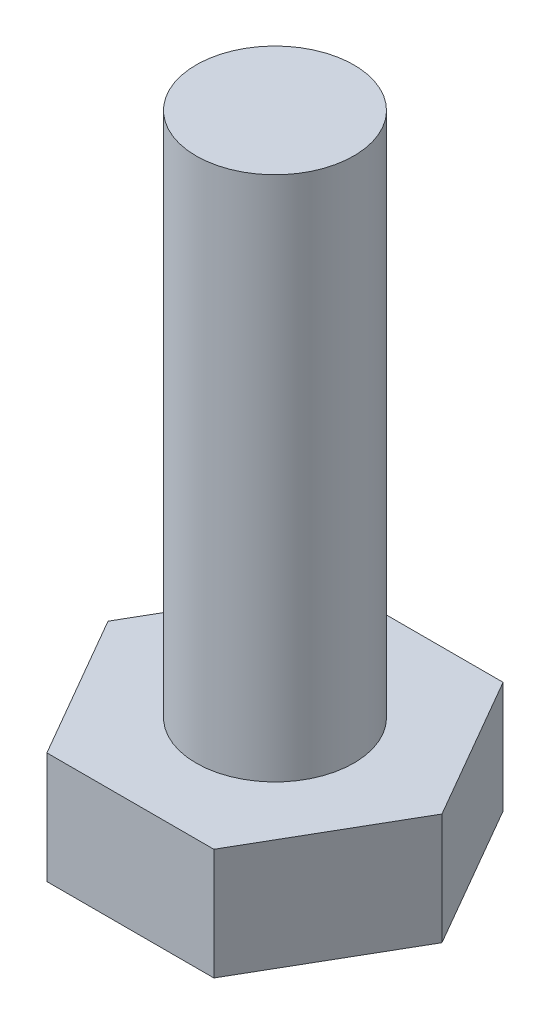
ISO-10303-21;
HEADER;
FILE_DESCRIPTION(('STEP AP214'),'2;1');
FILE_NAME('part.step','',(''),(''),'','','');
FILE_SCHEMA(('AUTOMOTIVE_DESIGN { 1 0 10303 214 1 1 1 1 }'));
ENDSEC;
DATA;
#1=APPLICATION_CONTEXT('core data for automotive mechanical design processes');
#2=APPLICATION_PROTOCOL_DEFINITION('international standard','automotive_design',2000,#1);
#3=PRODUCT_CONTEXT('',#1,'mechanical');
#4=PRODUCT('Part','Part','',(#3));
#5=PRODUCT_RELATED_PRODUCT_CATEGORY('part','',(#4));
#6=PRODUCT_DEFINITION_FORMATION('','',#4);
#7=PRODUCT_DEFINITION_CONTEXT('part definition',#1,'design');
#8=PRODUCT_DEFINITION('design','',#6,#7);
#9=PRODUCT_DEFINITION_SHAPE('','',#8);
#10=(LENGTH_UNIT() NAMED_UNIT(*) SI_UNIT(.MILLI.,.METRE.));
#11=(NAMED_UNIT(*) PLANE_ANGLE_UNIT() SI_UNIT($,.RADIAN.));
#12=(NAMED_UNIT(*) SI_UNIT($,.STERADIAN.) SOLID_ANGLE_UNIT());
#13=UNCERTAINTY_MEASURE_WITH_UNIT(LENGTH_MEASURE(1.E-05),#10,'distance_accuracy_value','');
#14=(GEOMETRIC_REPRESENTATION_CONTEXT(3) GLOBAL_UNCERTAINTY_ASSIGNED_CONTEXT((#13)) GLOBAL_UNIT_ASSIGNED_CONTEXT((#10,
#11,#12)) REPRESENTATION_CONTEXT('',''));
#15=CARTESIAN_POINT('',(0.,0.,0.));
#16=DIRECTION('',(0.,0.,1.));
#17=DIRECTION('',(1.,0.,0.));
#18=AXIS2_PLACEMENT_3D('',#15,#16,#17);
#19=CARTESIAN_POINT('',(0.,10.,0.));
#20=DIRECTION('',(0.,-1.,0.));
#21=DIRECTION('',(0.,0.,-1.));
#22=AXIS2_PLACEMENT_3D('',#19,#20,#21);
#23=CYLINDRICAL_SURFACE('',#22,1.5);
#24=CARTESIAN_POINT('',(0.,10.,0.));
#25=DIRECTION('',(0.,1.,0.));
#26=DIRECTION('',(0.,0.,1.));
#27=AXIS2_PLACEMENT_3D('',#24,#25,#26);
#28=CIRCLE('',#27,1.5);
#29=CARTESIAN_POINT('',(0.,10.,1.5));
#30=VERTEX_POINT('',#29);
#31=EDGE_CURVE('E11',#30,#30,#28,.T.);
#32=ORIENTED_EDGE('',*,*,#31,.F.);
#33=EDGE_LOOP('',(#32));
#34=FACE_BOUND('',#33,.T.);
#35=CARTESIAN_POINT('',(0.,0.,0.));
#36=DIRECTION('',(0.,1.,0.));
#37=DIRECTION('',(0.,0.,1.));
#38=AXIS2_PLACEMENT_3D('',#35,#36,#37);
#39=CIRCLE('',#38,1.5);
#40=CARTESIAN_POINT('',(0.,0.,1.5));
#41=VERTEX_POINT('',#40);
#42=EDGE_CURVE('E37',#41,#41,#39,.T.);
#43=ORIENTED_EDGE('',*,*,#42,.T.);
#44=EDGE_LOOP('',(#43));
#45=FACE_BOUND('',#44,.T.);
#46=ADVANCED_FACE('F34',(#34,#45),#23,.T.);
#47=CARTESIAN_POINT('',(0.,10.,0.));
#48=DIRECTION('',(0.,1.,0.));
#49=DIRECTION('',(0.,0.,1.));
#50=AXIS2_PLACEMENT_3D('',#47,#48,#49);
#51=PLANE('',#50);
#52=ORIENTED_EDGE('',*,*,#31,.T.);
#53=EDGE_LOOP('',(#52));
#54=FACE_BOUND('',#53,.T.);
#55=ADVANCED_FACE('F161',(#54),#51,.T.);
#56=CARTESIAN_POINT('',(-3.17542648054294,-2.12,0.));
#57=DIRECTION('',(0.866025403784439,0.,0.5));
#58=DIRECTION('',(0.5,0.,-0.866025403784439));
#59=AXIS2_PLACEMENT_3D('',#56,#57,#58);
#60=PLANE('',#59);
#61=DIRECTION('',(0.5,0.,-0.866025403784439));
#62=VECTOR('',#61,1.);
#63=CARTESIAN_POINT('',(-3.17542648054294,0.,0.));
#64=LINE('',#63,#62);
#65=CARTESIAN_POINT('',(-3.17542648054294,0.,0.));
#66=VERTEX_POINT('',#65);
#67=CARTESIAN_POINT('',(-1.58771324027147,0.,-2.75));
#68=VERTEX_POINT('',#67);
#69=EDGE_CURVE('E119',#66,#68,#64,.T.);
#70=ORIENTED_EDGE('',*,*,#69,.T.);
#71=DIRECTION('',(0.,1.,0.));
#72=VECTOR('',#71,1.);
#73=CARTESIAN_POINT('',(-1.58771324027147,-2.12,-2.75));
#74=LINE('',#73,#72);
#75=CARTESIAN_POINT('',(-1.58771324027147,-2.12,-2.75));
#76=VERTEX_POINT('',#75);
#77=EDGE_CURVE('E136',#76,#68,#74,.T.);
#78=ORIENTED_EDGE('',*,*,#77,.F.);
#79=DIRECTION('',(0.5,0.,-0.866025403784439));
#80=VECTOR('',#79,1.);
#81=CARTESIAN_POINT('',(-3.17542648054294,-2.12,0.));
#82=LINE('',#81,#80);
#83=CARTESIAN_POINT('',(-3.17542648054294,-2.12,0.));
#84=VERTEX_POINT('',#83);
#85=EDGE_CURVE('E129',#84,#76,#82,.T.);
#86=ORIENTED_EDGE('',*,*,#85,.F.);
#87=DIRECTION('',(0.,1.,0.));
#88=VECTOR('',#87,1.);
#89=CARTESIAN_POINT('',(-3.17542648054294,-2.12,0.));
#90=LINE('',#89,#88);
#91=EDGE_CURVE('E115',#84,#66,#90,.T.);
#92=ORIENTED_EDGE('',*,*,#91,.T.);
#93=EDGE_LOOP('',(#70,#78,#86,#92));
#94=FACE_BOUND('',#93,.T.);
#95=ADVANCED_FACE('F149',(#94),#60,.F.);
#96=CARTESIAN_POINT('',(-1.58771324027147,-2.12,-2.75));
#97=DIRECTION('',(0.,0.,1.));
#98=DIRECTION('',(1.,0.,0.));
#99=AXIS2_PLACEMENT_3D('',#96,#97,#98);
#100=PLANE('',#99);
#101=DIRECTION('',(1.,0.,0.));
#102=VECTOR('',#101,1.);
#103=CARTESIAN_POINT('',(-1.58771324027147,0.,-2.75));
#104=LINE('',#103,#102);
#105=CARTESIAN_POINT('',(1.58771324027147,0.,-2.75));
#106=VERTEX_POINT('',#105);
#107=EDGE_CURVE('E122',#68,#106,#104,.T.);
#108=ORIENTED_EDGE('',*,*,#107,.T.);
#109=DIRECTION('',(0.,1.,0.));
#110=VECTOR('',#109,1.);
#111=CARTESIAN_POINT('',(1.58771324027147,-2.12,-2.75));
#112=LINE('',#111,#110);
#113=CARTESIAN_POINT('',(1.58771324027147,-2.12,-2.75));
#114=VERTEX_POINT('',#113);
#115=EDGE_CURVE('E133',#114,#106,#112,.T.);
#116=ORIENTED_EDGE('',*,*,#115,.F.);
#117=DIRECTION('',(1.,0.,0.));
#118=VECTOR('',#117,1.);
#119=CARTESIAN_POINT('',(-1.58771324027147,-2.12,-2.75));
#120=LINE('',#119,#118);
#121=EDGE_CURVE('E88',#76,#114,#120,.T.);
#122=ORIENTED_EDGE('',*,*,#121,.F.);
#123=ORIENTED_EDGE('',*,*,#77,.T.);
#124=EDGE_LOOP('',(#108,#116,#122,#123));
#125=FACE_BOUND('',#124,.T.);
#126=ADVANCED_FACE('F171',(#125),#100,.F.);
#127=CARTESIAN_POINT('',(1.58771324027147,-2.12,-2.75));
#128=DIRECTION('',(-0.866025403784439,0.,0.5));
#129=DIRECTION('',(0.5,0.,0.866025403784439));
#130=AXIS2_PLACEMENT_3D('',#127,#128,#129);
#131=PLANE('',#130);
#132=DIRECTION('',(0.5,0.,0.866025403784439));
#133=VECTOR('',#132,1.);
#134=CARTESIAN_POINT('',(1.58771324027147,0.,-2.75));
#135=LINE('',#134,#133);
#136=CARTESIAN_POINT('',(3.17542648054294,0.,0.));
#137=VERTEX_POINT('',#136);
#138=EDGE_CURVE('E124',#106,#137,#135,.T.);
#139=ORIENTED_EDGE('',*,*,#138,.T.);
#140=DIRECTION('',(0.,1.,0.));
#141=VECTOR('',#140,1.);
#142=CARTESIAN_POINT('',(3.17542648054294,-2.12,0.));
#143=LINE('',#142,#141);
#144=CARTESIAN_POINT('',(3.17542648054294,-2.12,0.));
#145=VERTEX_POINT('',#144);
#146=EDGE_CURVE('E110',#145,#137,#143,.T.);
#147=ORIENTED_EDGE('',*,*,#146,.F.);
#148=DIRECTION('',(0.5,0.,0.866025403784439));
#149=VECTOR('',#148,1.);
#150=CARTESIAN_POINT('',(1.58771324027147,-2.12,-2.75));
#151=LINE('',#150,#149);
#152=EDGE_CURVE('E101',#114,#145,#151,.T.);
#153=ORIENTED_EDGE('',*,*,#152,.F.);
#154=ORIENTED_EDGE('',*,*,#115,.T.);
#155=EDGE_LOOP('',(#139,#147,#153,#154));
#156=FACE_BOUND('',#155,.T.);
#157=ADVANCED_FACE('F176',(#156),#131,.F.);
#158=CARTESIAN_POINT('',(3.17542648054294,-2.12,0.));
#159=DIRECTION('',(-0.866025403784439,0.,-0.5));
#160=DIRECTION('',(-0.5,0.,0.866025403784439));
#161=AXIS2_PLACEMENT_3D('',#158,#159,#160);
#162=PLANE('',#161);
#163=DIRECTION('',(-0.5,0.,0.866025403784438));
#164=VECTOR('',#163,1.);
#165=CARTESIAN_POINT('',(3.17542648054294,0.,0.));
#166=LINE('',#165,#164);
#167=CARTESIAN_POINT('',(1.58771324027147,0.,2.75));
#168=VERTEX_POINT('',#167);
#169=EDGE_CURVE('E109',#137,#168,#166,.T.);
#170=ORIENTED_EDGE('',*,*,#169,.T.);
#171=DIRECTION('',(0.,1.,0.));
#172=VECTOR('',#171,1.);
#173=CARTESIAN_POINT('',(1.58771324027147,-2.12,2.75));
#174=LINE('',#173,#172);
#175=CARTESIAN_POINT('',(1.58771324027147,-2.12,2.75));
#176=VERTEX_POINT('',#175);
#177=EDGE_CURVE('E106',#176,#168,#174,.T.);
#178=ORIENTED_EDGE('',*,*,#177,.F.);
#179=DIRECTION('',(-0.5,0.,0.866025403784438));
#180=VECTOR('',#179,1.);
#181=CARTESIAN_POINT('',(3.17542648054294,-2.12,0.));
#182=LINE('',#181,#180);
#183=EDGE_CURVE('E95',#145,#176,#182,.T.);
#184=ORIENTED_EDGE('',*,*,#183,.F.);
#185=ORIENTED_EDGE('',*,*,#146,.T.);
#186=EDGE_LOOP('',(#170,#178,#184,#185));
#187=FACE_BOUND('',#186,.T.);
#188=ADVANCED_FACE('F107',(#187),#162,.F.);
#189=CARTESIAN_POINT('',(1.58771324027147,-2.12,2.75));
#190=DIRECTION('',(0.,0.,-1.));
#191=DIRECTION('',(-1.,0.,0.));
#192=AXIS2_PLACEMENT_3D('',#189,#190,#191);
#193=PLANE('',#192);
#194=DIRECTION('',(-1.,0.,0.));
#195=VECTOR('',#194,1.);
#196=CARTESIAN_POINT('',(1.58771324027147,0.,2.75));
#197=LINE('',#196,#195);
#198=CARTESIAN_POINT('',(-1.58771324027147,0.,2.75));
#199=VERTEX_POINT('',#198);
#200=EDGE_CURVE('E73',#168,#199,#197,.T.);
#201=ORIENTED_EDGE('',*,*,#200,.T.);
#202=DIRECTION('',(0.,1.,0.));
#203=VECTOR('',#202,1.);
#204=CARTESIAN_POINT('',(-1.58771324027147,-2.12,2.75));
#205=LINE('',#204,#203);
#206=CARTESIAN_POINT('',(-1.58771324027147,-2.12,2.75));
#207=VERTEX_POINT('',#206);
#208=EDGE_CURVE('E111',#207,#199,#205,.T.);
#209=ORIENTED_EDGE('',*,*,#208,.F.);
#210=DIRECTION('',(-1.,0.,0.));
#211=VECTOR('',#210,1.);
#212=CARTESIAN_POINT('',(1.58771324027147,-2.12,2.75));
#213=LINE('',#212,#211);
#214=EDGE_CURVE('E99',#176,#207,#213,.T.);
#215=ORIENTED_EDGE('',*,*,#214,.F.);
#216=ORIENTED_EDGE('',*,*,#177,.T.);
#217=EDGE_LOOP('',(#201,#209,#215,#216));
#218=FACE_BOUND('',#217,.T.);
#219=ADVANCED_FACE('F113',(#218),#193,.F.);
#220=CARTESIAN_POINT('',(-1.58771324027147,-2.12,2.75));
#221=DIRECTION('',(0.866025403784438,0.,-0.5));
#222=DIRECTION('',(-0.5,0.,-0.866025403784439));
#223=AXIS2_PLACEMENT_3D('',#220,#221,#222);
#224=PLANE('',#223);
#225=DIRECTION('',(-0.5,0.,-0.866025403784438));
#226=VECTOR('',#225,1.);
#227=CARTESIAN_POINT('',(-1.58771324027147,0.,2.75));
#228=LINE('',#227,#226);
#229=EDGE_CURVE('E79',#199,#66,#228,.T.);
#230=ORIENTED_EDGE('',*,*,#229,.T.);
#231=ORIENTED_EDGE('',*,*,#91,.F.);
#232=DIRECTION('',(-0.5,0.,-0.866025403784438));
#233=VECTOR('',#232,1.);
#234=CARTESIAN_POINT('',(-1.58771324027147,-2.12,2.75));
#235=LINE('',#234,#233);
#236=EDGE_CURVE('E50',#207,#84,#235,.T.);
#237=ORIENTED_EDGE('',*,*,#236,.F.);
#238=ORIENTED_EDGE('',*,*,#208,.T.);
#239=EDGE_LOOP('',(#230,#231,#237,#238));
#240=FACE_BOUND('',#239,.T.);
#241=ADVANCED_FACE('F151',(#240),#224,.F.);
#242=CARTESIAN_POINT('',(0.,-2.12,0.));
#243=DIRECTION('',(0.,-1.,0.));
#244=DIRECTION('',(0.,0.,-1.));
#245=AXIS2_PLACEMENT_3D('',#242,#243,#244);
#246=PLANE('',#245);
#247=ORIENTED_EDGE('',*,*,#85,.T.);
#248=ORIENTED_EDGE('',*,*,#121,.T.);
#249=ORIENTED_EDGE('',*,*,#152,.T.);
#250=ORIENTED_EDGE('',*,*,#183,.T.);
#251=ORIENTED_EDGE('',*,*,#214,.T.);
#252=ORIENTED_EDGE('',*,*,#236,.T.);
#253=EDGE_LOOP('',(#247,#248,#249,#250,#251,#252));
#254=FACE_BOUND('',#253,.T.);
#255=ADVANCED_FACE('F97',(#254),#246,.T.);
#256=CARTESIAN_POINT('',(0.,0.,0.));
#257=DIRECTION('',(0.,-1.,0.));
#258=DIRECTION('',(0.,0.,-1.));
#259=AXIS2_PLACEMENT_3D('',#256,#257,#258);
#260=PLANE('',#259);
#261=ORIENTED_EDGE('',*,*,#42,.F.);
#262=EDGE_LOOP('',(#261));
#263=FACE_BOUND('',#262,.T.);
#264=ORIENTED_EDGE('',*,*,#69,.F.);
#265=ORIENTED_EDGE('',*,*,#229,.F.);
#266=ORIENTED_EDGE('',*,*,#200,.F.);
#267=ORIENTED_EDGE('',*,*,#169,.F.);
#268=ORIENTED_EDGE('',*,*,#138,.F.);
#269=ORIENTED_EDGE('',*,*,#107,.F.);
#270=EDGE_LOOP('',(#264,#265,#266,#267,#268,#269));
#271=FACE_BOUND('',#270,.T.);
#272=ADVANCED_FACE('F142',(#263,#271),#260,.F.);
#273=CLOSED_SHELL('',(#46,#55,#95,#126,#157,#188,#219,#241,#255,#272));
#274=MANIFOLD_SOLID_BREP('B2',#273);
#275=ADVANCED_BREP_SHAPE_REPRESENTATION('',(#18,#274),#14);
#276=SHAPE_DEFINITION_REPRESENTATION(#9,#275);
ENDSEC;
END-ISO-10303-21;
